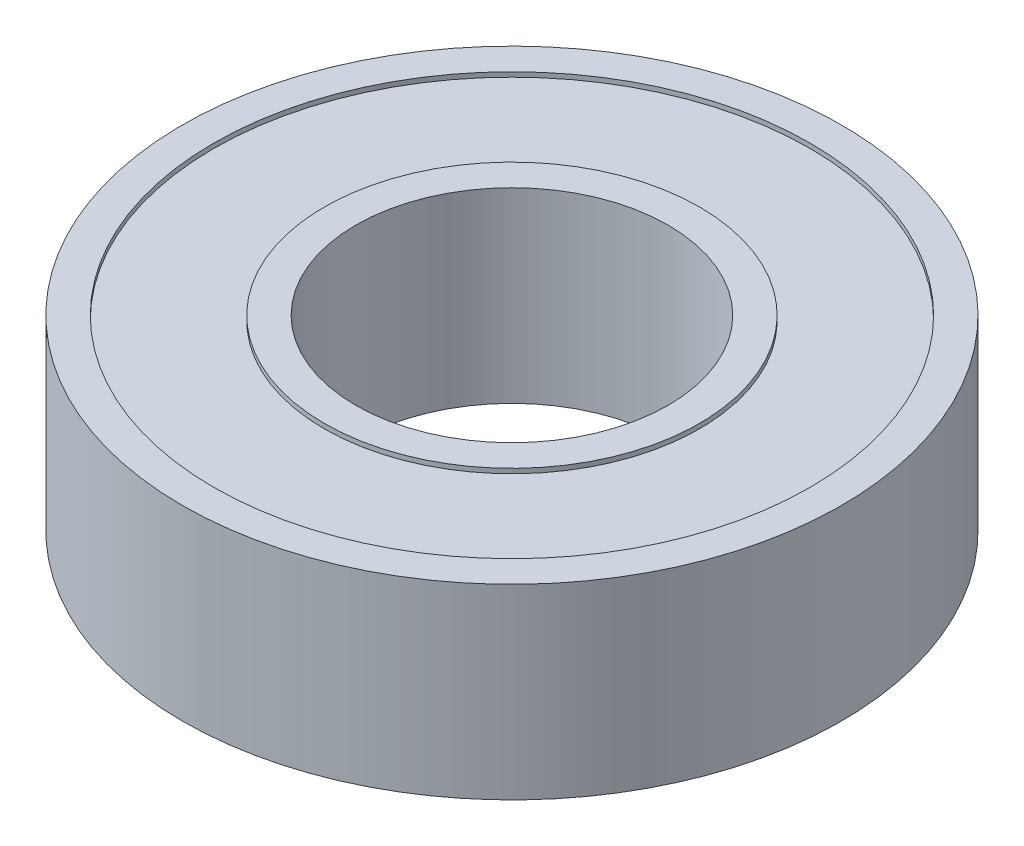
ISO-10303-21;
HEADER;
FILE_DESCRIPTION(('STEP AP214'),'2;1');
FILE_NAME('part.step','',(''),(''),'','','');
FILE_SCHEMA(('AUTOMOTIVE_DESIGN { 1 0 10303 214 1 1 1 1 }'));
ENDSEC;
DATA;
#1=APPLICATION_CONTEXT('core data for automotive mechanical design processes');
#2=APPLICATION_PROTOCOL_DEFINITION('international standard','automotive_design',2000,#1);
#3=PRODUCT_CONTEXT('',#1,'mechanical');
#4=PRODUCT('Part','Part','',(#3));
#5=PRODUCT_RELATED_PRODUCT_CATEGORY('part','',(#4));
#6=PRODUCT_DEFINITION_FORMATION('','',#4);
#7=PRODUCT_DEFINITION_CONTEXT('part definition',#1,'design');
#8=PRODUCT_DEFINITION('design','',#6,#7);
#9=PRODUCT_DEFINITION_SHAPE('','',#8);
#10=(LENGTH_UNIT() NAMED_UNIT(*) SI_UNIT(.MILLI.,.METRE.));
#11=(NAMED_UNIT(*) PLANE_ANGLE_UNIT() SI_UNIT($,.RADIAN.));
#12=(NAMED_UNIT(*) SI_UNIT($,.STERADIAN.) SOLID_ANGLE_UNIT());
#13=UNCERTAINTY_MEASURE_WITH_UNIT(LENGTH_MEASURE(1.E-05),#10,'distance_accuracy_value','');
#14=(GEOMETRIC_REPRESENTATION_CONTEXT(3) GLOBAL_UNCERTAINTY_ASSIGNED_CONTEXT((#13)) GLOBAL_UNIT_ASSIGNED_CONTEXT((#10,
#11,#12)) REPRESENTATION_CONTEXT('',''));
#15=CARTESIAN_POINT('',(0.,0.,0.));
#16=DIRECTION('',(0.,0.,1.));
#17=DIRECTION('',(1.,0.,0.));
#18=AXIS2_PLACEMENT_3D('',#15,#16,#17);
#19=CARTESIAN_POINT('',(0.,-5.95,0.));
#20=DIRECTION('',(0.,1.,0.));
#21=DIRECTION('',(0.,0.,1.));
#22=AXIS2_PLACEMENT_3D('',#19,#20,#21);
#23=PLANE('',#22);
#24=CARTESIAN_POINT('',(0.,-5.95,0.));
#25=DIRECTION('',(0.,1.,0.));
#26=DIRECTION('',(0.,0.,1.));
#27=AXIS2_PLACEMENT_3D('',#24,#25,#26);
#28=CIRCLE('',#27,9.95);
#29=CARTESIAN_POINT('',(0.,-5.95,9.95));
#30=VERTEX_POINT('',#29);
#31=EDGE_CURVE('E45',#30,#30,#28,.T.);
#32=ORIENTED_EDGE('',*,*,#31,.T.);
#33=EDGE_LOOP('',(#32));
#34=FACE_BOUND('',#33,.T.);
#35=CARTESIAN_POINT('',(0.,-5.95,0.));
#36=DIRECTION('',(0.,1.,0.));
#37=DIRECTION('',(0.,0.,1.));
#38=AXIS2_PLACEMENT_3D('',#35,#36,#37);
#39=CIRCLE('',#38,11.95);
#40=CARTESIAN_POINT('',(0.,-5.95,11.95));
#41=VERTEX_POINT('',#40);
#42=EDGE_CURVE('E69',#41,#41,#39,.T.);
#43=ORIENTED_EDGE('',*,*,#42,.F.);
#44=EDGE_LOOP('',(#43));
#45=FACE_BOUND('',#44,.T.);
#46=ADVANCED_FACE('F32',(#34,#45),#23,.F.);
#47=CARTESIAN_POINT('',(0.,5.95,0.));
#48=DIRECTION('',(0.,1.,0.));
#49=DIRECTION('',(0.,0.,1.));
#50=AXIS2_PLACEMENT_3D('',#47,#48,#49);
#51=PLANE('',#50);
#52=CARTESIAN_POINT('',(0.,5.95,0.));
#53=DIRECTION('',(0.,1.,0.));
#54=DIRECTION('',(0.,0.,1.));
#55=AXIS2_PLACEMENT_3D('',#52,#53,#54);
#56=CIRCLE('',#55,9.95);
#57=CARTESIAN_POINT('',(0.,5.95,9.95));
#58=VERTEX_POINT('',#57);
#59=EDGE_CURVE('E43',#58,#58,#56,.T.);
#60=ORIENTED_EDGE('',*,*,#59,.F.);
#61=EDGE_LOOP('',(#60));
#62=FACE_BOUND('',#61,.T.);
#63=CARTESIAN_POINT('',(0.,5.95,0.));
#64=DIRECTION('',(0.,1.,0.));
#65=DIRECTION('',(0.,0.,1.));
#66=AXIS2_PLACEMENT_3D('',#63,#64,#65);
#67=CIRCLE('',#66,11.95);
#68=CARTESIAN_POINT('',(0.,5.95,11.95));
#69=VERTEX_POINT('',#68);
#70=EDGE_CURVE('E57',#69,#69,#67,.T.);
#71=ORIENTED_EDGE('',*,*,#70,.T.);
#72=EDGE_LOOP('',(#71));
#73=FACE_BOUND('',#72,.T.);
#74=ADVANCED_FACE('F85',(#62,#73),#51,.T.);
#75=CARTESIAN_POINT('',(0.,5.95,0.));
#76=DIRECTION('',(0.,1.,0.));
#77=DIRECTION('',(0.,0.,1.));
#78=AXIS2_PLACEMENT_3D('',#75,#76,#77);
#79=CIRCLE('',#78,19.);
#80=CARTESIAN_POINT('',(0.,5.95,19.));
#81=VERTEX_POINT('',#80);
#82=EDGE_CURVE('E51',#81,#81,#79,.T.);
#83=ORIENTED_EDGE('',*,*,#82,.F.);
#84=EDGE_LOOP('',(#83));
#85=FACE_BOUND('',#84,.T.);
#86=CARTESIAN_POINT('',(0.,5.95,0.));
#87=DIRECTION('',(0.,1.,0.));
#88=DIRECTION('',(0.,0.,1.));
#89=AXIS2_PLACEMENT_3D('',#86,#87,#88);
#90=CIRCLE('',#89,21.);
#91=CARTESIAN_POINT('',(0.,5.95,21.));
#92=VERTEX_POINT('',#91);
#93=EDGE_CURVE('E10',#92,#92,#90,.T.);
#94=ORIENTED_EDGE('',*,*,#93,.T.);
#95=EDGE_LOOP('',(#94));
#96=FACE_BOUND('',#95,.T.);
#97=ADVANCED_FACE('F91',(#85,#96),#51,.T.);
#98=CARTESIAN_POINT('',(0.,-5.95,0.));
#99=DIRECTION('',(0.,1.,0.));
#100=DIRECTION('',(0.,0.,1.));
#101=AXIS2_PLACEMENT_3D('',#98,#99,#100);
#102=CIRCLE('',#101,19.);
#103=CARTESIAN_POINT('',(0.,-5.95,19.));
#104=VERTEX_POINT('',#103);
#105=EDGE_CURVE('E63',#104,#104,#102,.T.);
#106=ORIENTED_EDGE('',*,*,#105,.T.);
#107=EDGE_LOOP('',(#106));
#108=FACE_BOUND('',#107,.T.);
#109=CARTESIAN_POINT('',(0.,-5.95,0.));
#110=DIRECTION('',(0.,1.,0.));
#111=DIRECTION('',(0.,0.,1.));
#112=AXIS2_PLACEMENT_3D('',#109,#110,#111);
#113=CIRCLE('',#112,21.);
#114=CARTESIAN_POINT('',(0.,-5.95,21.));
#115=VERTEX_POINT('',#114);
#116=EDGE_CURVE('E36',#115,#115,#113,.T.);
#117=ORIENTED_EDGE('',*,*,#116,.F.);
#118=EDGE_LOOP('',(#117));
#119=FACE_BOUND('',#118,.T.);
#120=ADVANCED_FACE('F87',(#108,#119),#23,.F.);
#121=CARTESIAN_POINT('',(0.,5.95,0.));
#122=DIRECTION('',(0.,-1.,0.));
#123=DIRECTION('',(0.,0.,-1.));
#124=AXIS2_PLACEMENT_3D('',#121,#122,#123);
#125=CYLINDRICAL_SURFACE('',#124,21.);
#126=ORIENTED_EDGE('',*,*,#93,.F.);
#127=EDGE_LOOP('',(#126));
#128=FACE_BOUND('',#127,.T.);
#129=ORIENTED_EDGE('',*,*,#116,.T.);
#130=EDGE_LOOP('',(#129));
#131=FACE_BOUND('',#130,.T.);
#132=ADVANCED_FACE('F34',(#128,#131),#125,.T.);
#133=CARTESIAN_POINT('',(0.,5.95,0.));
#134=DIRECTION('',(0.,-1.,0.));
#135=DIRECTION('',(0.,0.,-1.));
#136=AXIS2_PLACEMENT_3D('',#133,#134,#135);
#137=CYLINDRICAL_SURFACE('',#136,9.95);
#138=ORIENTED_EDGE('',*,*,#59,.T.);
#139=EDGE_LOOP('',(#138));
#140=FACE_BOUND('',#139,.T.);
#141=ORIENTED_EDGE('',*,*,#31,.F.);
#142=EDGE_LOOP('',(#141));
#143=FACE_BOUND('',#142,.T.);
#144=ADVANCED_FACE('F100',(#140,#143),#137,.F.);
#145=CARTESIAN_POINT('',(0.,5.65,0.));
#146=DIRECTION('',(0.,1.,0.));
#147=DIRECTION('',(0.,0.,1.));
#148=AXIS2_PLACEMENT_3D('',#145,#146,#147);
#149=CYLINDRICAL_SURFACE('',#148,19.);
#150=CARTESIAN_POINT('',(0.,5.65,0.));
#151=DIRECTION('',(0.,1.,0.));
#152=DIRECTION('',(0.,0.,1.));
#153=AXIS2_PLACEMENT_3D('',#150,#151,#152);
#154=CIRCLE('',#153,19.);
#155=CARTESIAN_POINT('',(0.,5.65,19.));
#156=VERTEX_POINT('',#155);
#157=EDGE_CURVE('E48',#156,#156,#154,.T.);
#158=ORIENTED_EDGE('',*,*,#157,.F.);
#159=EDGE_LOOP('',(#158));
#160=FACE_BOUND('',#159,.T.);
#161=ORIENTED_EDGE('',*,*,#82,.T.);
#162=EDGE_LOOP('',(#161));
#163=FACE_BOUND('',#162,.T.);
#164=ADVANCED_FACE('F124',(#160,#163),#149,.F.);
#165=CARTESIAN_POINT('',(0.,5.65,0.));
#166=DIRECTION('',(0.,1.,0.));
#167=DIRECTION('',(0.,0.,1.));
#168=AXIS2_PLACEMENT_3D('',#165,#166,#167);
#169=PLANE('',#168);
#170=CARTESIAN_POINT('',(0.,5.65,0.));
#171=DIRECTION('',(0.,1.,0.));
#172=DIRECTION('',(0.,0.,1.));
#173=AXIS2_PLACEMENT_3D('',#170,#171,#172);
#174=CIRCLE('',#173,11.95);
#175=CARTESIAN_POINT('',(0.,5.65,11.95));
#176=VERTEX_POINT('',#175);
#177=EDGE_CURVE('E54',#176,#176,#174,.T.);
#178=ORIENTED_EDGE('',*,*,#177,.F.);
#179=EDGE_LOOP('',(#178));
#180=FACE_BOUND('',#179,.T.);
#181=ORIENTED_EDGE('',*,*,#157,.T.);
#182=EDGE_LOOP('',(#181));
#183=FACE_BOUND('',#182,.T.);
#184=ADVANCED_FACE('F120',(#180,#183),#169,.T.);
#185=CARTESIAN_POINT('',(0.,5.65,0.));
#186=DIRECTION('',(0.,1.,0.));
#187=DIRECTION('',(0.,0.,1.));
#188=AXIS2_PLACEMENT_3D('',#185,#186,#187);
#189=CYLINDRICAL_SURFACE('',#188,11.95);
#190=ORIENTED_EDGE('',*,*,#177,.T.);
#191=EDGE_LOOP('',(#190));
#192=FACE_BOUND('',#191,.T.);
#193=ORIENTED_EDGE('',*,*,#70,.F.);
#194=EDGE_LOOP('',(#193));
#195=FACE_BOUND('',#194,.T.);
#196=ADVANCED_FACE('F114',(#192,#195),#189,.T.);
#197=CARTESIAN_POINT('',(0.,-5.65,0.));
#198=DIRECTION('',(0.,-1.,0.));
#199=DIRECTION('',(0.,0.,1.));
#200=AXIS2_PLACEMENT_3D('',#197,#198,#199);
#201=PLANE('',#200);
#202=CARTESIAN_POINT('',(0.,-5.65,0.));
#203=DIRECTION('',(0.,1.,0.));
#204=DIRECTION('',(0.,0.,1.));
#205=AXIS2_PLACEMENT_3D('',#202,#203,#204);
#206=CIRCLE('',#205,19.);
#207=CARTESIAN_POINT('',(0.,-5.65,19.));
#208=VERTEX_POINT('',#207);
#209=EDGE_CURVE('E60',#208,#208,#206,.T.);
#210=ORIENTED_EDGE('',*,*,#209,.F.);
#211=EDGE_LOOP('',(#210));
#212=FACE_BOUND('',#211,.T.);
#213=CARTESIAN_POINT('',(0.,-5.65,0.));
#214=DIRECTION('',(0.,1.,0.));
#215=DIRECTION('',(0.,0.,1.));
#216=AXIS2_PLACEMENT_3D('',#213,#214,#215);
#217=CIRCLE('',#216,11.95);
#218=CARTESIAN_POINT('',(0.,-5.65,11.95));
#219=VERTEX_POINT('',#218);
#220=EDGE_CURVE('E66',#219,#219,#217,.T.);
#221=ORIENTED_EDGE('',*,*,#220,.T.);
#222=EDGE_LOOP('',(#221));
#223=FACE_BOUND('',#222,.T.);
#224=ADVANCED_FACE('F75',(#212,#223),#201,.T.);
#225=CARTESIAN_POINT('',(0.,-5.65,0.));
#226=DIRECTION('',(0.,-1.,0.));
#227=DIRECTION('',(0.,0.,-1.));
#228=AXIS2_PLACEMENT_3D('',#225,#226,#227);
#229=CYLINDRICAL_SURFACE('',#228,19.);
#230=ORIENTED_EDGE('',*,*,#209,.T.);
#231=EDGE_LOOP('',(#230));
#232=FACE_BOUND('',#231,.T.);
#233=ORIENTED_EDGE('',*,*,#105,.F.);
#234=EDGE_LOOP('',(#233));
#235=FACE_BOUND('',#234,.T.);
#236=ADVANCED_FACE('F80',(#232,#235),#229,.F.);
#237=CARTESIAN_POINT('',(0.,-5.65,0.));
#238=DIRECTION('',(0.,-1.,0.));
#239=DIRECTION('',(0.,0.,-1.));
#240=AXIS2_PLACEMENT_3D('',#237,#238,#239);
#241=CYLINDRICAL_SURFACE('',#240,11.95);
#242=ORIENTED_EDGE('',*,*,#220,.F.);
#243=EDGE_LOOP('',(#242));
#244=FACE_BOUND('',#243,.T.);
#245=ORIENTED_EDGE('',*,*,#42,.T.);
#246=EDGE_LOOP('',(#245));
#247=FACE_BOUND('',#246,.T.);
#248=ADVANCED_FACE('F77',(#244,#247),#241,.T.);
#249=CLOSED_SHELL('',(#46,#74,#97,#120,#132,#144,#164,#184,#196,#224,#236,#248));
#250=MANIFOLD_SOLID_BREP('B2',#249);
#251=ADVANCED_BREP_SHAPE_REPRESENTATION('',(#18,#250),#14);
#252=SHAPE_DEFINITION_REPRESENTATION(#9,#251);
ENDSEC;
END-ISO-10303-21;
